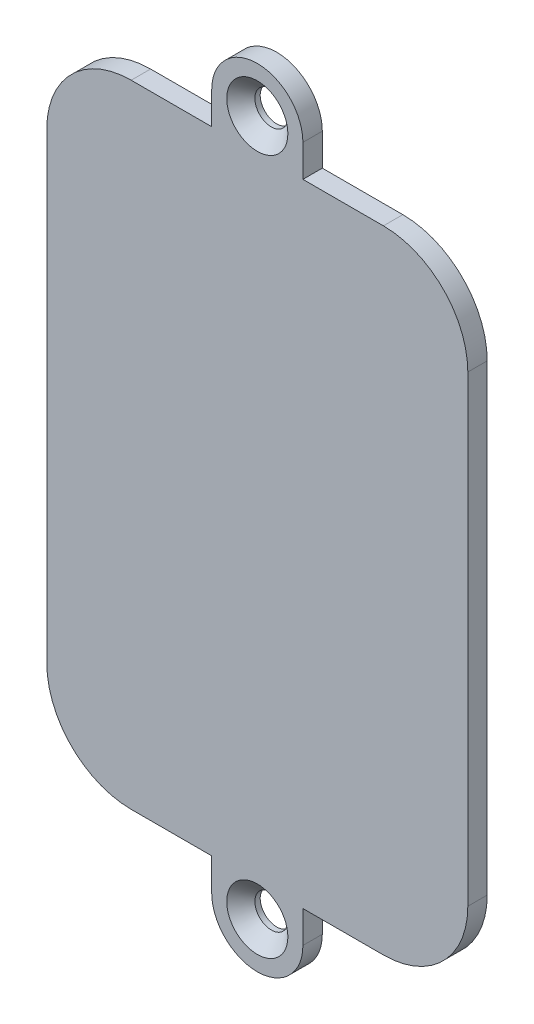
ISO-10303-21;
HEADER;
FILE_DESCRIPTION(('STEP AP214'),'2;1');
FILE_NAME('part.step','',(''),(''),'','','');
FILE_SCHEMA(('AUTOMOTIVE_DESIGN { 1 0 10303 214 1 1 1 1 }'));
ENDSEC;
DATA;
#1=APPLICATION_CONTEXT('core data for automotive mechanical design processes');
#2=APPLICATION_PROTOCOL_DEFINITION('international standard','automotive_design',2000,#1);
#3=PRODUCT_CONTEXT('',#1,'mechanical');
#4=PRODUCT('Part','Part','',(#3));
#5=PRODUCT_RELATED_PRODUCT_CATEGORY('part','',(#4));
#6=PRODUCT_DEFINITION_FORMATION('','',#4);
#7=PRODUCT_DEFINITION_CONTEXT('part definition',#1,'design');
#8=PRODUCT_DEFINITION('design','',#6,#7);
#9=PRODUCT_DEFINITION_SHAPE('','',#8);
#10=(LENGTH_UNIT() NAMED_UNIT(*) SI_UNIT(.MILLI.,.METRE.));
#11=(NAMED_UNIT(*) PLANE_ANGLE_UNIT() SI_UNIT($,.RADIAN.));
#12=(NAMED_UNIT(*) SI_UNIT($,.STERADIAN.) SOLID_ANGLE_UNIT());
#13=UNCERTAINTY_MEASURE_WITH_UNIT(LENGTH_MEASURE(1.E-05),#10,'distance_accuracy_value','');
#14=(GEOMETRIC_REPRESENTATION_CONTEXT(3) GLOBAL_UNCERTAINTY_ASSIGNED_CONTEXT((#13)) GLOBAL_UNIT_ASSIGNED_CONTEXT((#10,
#11,#12)) REPRESENTATION_CONTEXT('',''));
#15=CARTESIAN_POINT('',(0.,0.,0.));
#16=DIRECTION('',(0.,0.,1.));
#17=DIRECTION('',(1.,0.,0.));
#18=AXIS2_PLACEMENT_3D('',#15,#16,#17);
#19=CARTESIAN_POINT('',(0.,69.04,2.));
#20=DIRECTION('',(0.,0.,-1.));
#21=DIRECTION('',(-1.,0.,0.));
#22=AXIS2_PLACEMENT_3D('',#19,#20,#21);
#23=CYLINDRICAL_SURFACE('',#22,4.7);
#24=CARTESIAN_POINT('',(0.,69.04,0.));
#25=DIRECTION('',(0.,0.,1.));
#26=DIRECTION('',(1.,0.,0.));
#27=AXIS2_PLACEMENT_3D('',#24,#25,#26);
#28=CIRCLE('',#27,4.7);
#29=CARTESIAN_POINT('',(4.7,69.04,0.));
#30=VERTEX_POINT('',#29);
#31=CARTESIAN_POINT('',(-4.7,69.04,0.));
#32=VERTEX_POINT('',#31);
#33=EDGE_CURVE('E177',#30,#32,#28,.T.);
#34=ORIENTED_EDGE('',*,*,#33,.T.);
#35=DIRECTION('',(0.,0.,-1.));
#36=VECTOR('',#35,1.);
#37=CARTESIAN_POINT('',(-4.7,69.04,2.));
#38=LINE('',#37,#36);
#39=CARTESIAN_POINT('',(-4.7,69.04,2.));
#40=VERTEX_POINT('',#39);
#41=EDGE_CURVE('E11',#40,#32,#38,.T.);
#42=ORIENTED_EDGE('',*,*,#41,.F.);
#43=CARTESIAN_POINT('',(0.,69.04,2.));
#44=DIRECTION('',(0.,0.,1.));
#45=DIRECTION('',(1.,0.,0.));
#46=AXIS2_PLACEMENT_3D('',#43,#44,#45);
#47=CIRCLE('',#46,4.7);
#48=CARTESIAN_POINT('',(4.7,69.04,2.));
#49=VERTEX_POINT('',#48);
#50=EDGE_CURVE('E208',#49,#40,#47,.T.);
#51=ORIENTED_EDGE('',*,*,#50,.F.);
#52=DIRECTION('',(0.,0.,-1.));
#53=VECTOR('',#52,1.);
#54=CARTESIAN_POINT('',(4.7,69.04,2.));
#55=LINE('',#54,#53);
#56=EDGE_CURVE('E173',#49,#30,#55,.T.);
#57=ORIENTED_EDGE('',*,*,#56,.T.);
#58=EDGE_LOOP('',(#34,#42,#51,#57));
#59=FACE_BOUND('',#58,.T.);
#60=ADVANCED_FACE('F33',(#59),#23,.T.);
#61=CARTESIAN_POINT('',(-4.7,69.04,2.));
#62=DIRECTION('',(1.,0.,0.));
#63=DIRECTION('',(0.,1.,0.));
#64=AXIS2_PLACEMENT_3D('',#61,#62,#63);
#65=PLANE('',#64);
#66=DIRECTION('',(0.,-1.,0.));
#67=VECTOR('',#66,1.);
#68=CARTESIAN_POINT('',(-4.7,69.04,0.));
#69=LINE('',#68,#67);
#70=CARTESIAN_POINT('',(-4.7,65.74,0.));
#71=VERTEX_POINT('',#70);
#72=EDGE_CURVE('E180',#32,#71,#69,.T.);
#73=ORIENTED_EDGE('',*,*,#72,.T.);
#74=DIRECTION('',(0.,0.,-1.));
#75=VECTOR('',#74,1.);
#76=CARTESIAN_POINT('',(-4.7,65.74,2.));
#77=LINE('',#76,#75);
#78=CARTESIAN_POINT('',(-4.7,65.74,2.));
#79=VERTEX_POINT('',#78);
#80=EDGE_CURVE('E41',#79,#71,#77,.T.);
#81=ORIENTED_EDGE('',*,*,#80,.F.);
#82=DIRECTION('',(0.,-1.,0.));
#83=VECTOR('',#82,1.);
#84=CARTESIAN_POINT('',(-4.7,69.04,2.));
#85=LINE('',#84,#83);
#86=EDGE_CURVE('E116',#40,#79,#85,.T.);
#87=ORIENTED_EDGE('',*,*,#86,.F.);
#88=ORIENTED_EDGE('',*,*,#41,.T.);
#89=EDGE_LOOP('',(#73,#81,#87,#88));
#90=FACE_BOUND('',#89,.T.);
#91=ADVANCED_FACE('F307',(#90),#65,.F.);
#92=CARTESIAN_POINT('',(-4.7,65.74,2.));
#93=DIRECTION('',(0.,-1.,0.));
#94=DIRECTION('',(0.,0.,-1.));
#95=AXIS2_PLACEMENT_3D('',#92,#93,#94);
#96=PLANE('',#95);
#97=DIRECTION('',(-1.,0.,0.));
#98=VECTOR('',#97,1.);
#99=CARTESIAN_POINT('',(-4.7,65.74,0.));
#100=LINE('',#99,#98);
#101=CARTESIAN_POINT('',(-13.,65.74,0.));
#102=VERTEX_POINT('',#101);
#103=EDGE_CURVE('E183',#71,#102,#100,.T.);
#104=ORIENTED_EDGE('',*,*,#103,.T.);
#105=DIRECTION('',(0.,0.,-1.));
#106=VECTOR('',#105,1.);
#107=CARTESIAN_POINT('',(-13.,65.74,2.));
#108=LINE('',#107,#106);
#109=CARTESIAN_POINT('',(-13.,65.74,2.));
#110=VERTEX_POINT('',#109);
#111=EDGE_CURVE('E239',#110,#102,#108,.T.);
#112=ORIENTED_EDGE('',*,*,#111,.F.);
#113=DIRECTION('',(-1.,0.,0.));
#114=VECTOR('',#113,1.);
#115=CARTESIAN_POINT('',(-4.7,65.74,2.));
#116=LINE('',#115,#114);
#117=EDGE_CURVE('E247',#79,#110,#116,.T.);
#118=ORIENTED_EDGE('',*,*,#117,.F.);
#119=ORIENTED_EDGE('',*,*,#80,.T.);
#120=EDGE_LOOP('',(#104,#112,#118,#119));
#121=FACE_BOUND('',#120,.T.);
#122=ADVANCED_FACE('F245',(#121),#96,.F.);
#123=CARTESIAN_POINT('',(-13.,57.04,2.));
#124=DIRECTION('',(0.,0.,-1.));
#125=DIRECTION('',(-1.,0.,0.));
#126=AXIS2_PLACEMENT_3D('',#123,#124,#125);
#127=CYLINDRICAL_SURFACE('',#126,8.7);
#128=CARTESIAN_POINT('',(-13.,57.04,0.));
#129=DIRECTION('',(0.,0.,1.));
#130=DIRECTION('',(1.,0.,0.));
#131=AXIS2_PLACEMENT_3D('',#128,#129,#130);
#132=CIRCLE('',#131,8.7);
#133=CARTESIAN_POINT('',(-21.7,57.04,0.));
#134=VERTEX_POINT('',#133);
#135=EDGE_CURVE('E185',#102,#134,#132,.T.);
#136=ORIENTED_EDGE('',*,*,#135,.T.);
#137=DIRECTION('',(0.,0.,-1.));
#138=VECTOR('',#137,1.);
#139=CARTESIAN_POINT('',(-21.7,57.04,2.));
#140=LINE('',#139,#138);
#141=CARTESIAN_POINT('',(-21.7,57.04,2.));
#142=VERTEX_POINT('',#141);
#143=EDGE_CURVE('E236',#142,#134,#140,.T.);
#144=ORIENTED_EDGE('',*,*,#143,.F.);
#145=CARTESIAN_POINT('',(-13.,57.04,2.));
#146=DIRECTION('',(0.,0.,1.));
#147=DIRECTION('',(1.,0.,0.));
#148=AXIS2_PLACEMENT_3D('',#145,#146,#147);
#149=CIRCLE('',#148,8.7);
#150=EDGE_CURVE('E265',#110,#142,#149,.T.);
#151=ORIENTED_EDGE('',*,*,#150,.F.);
#152=ORIENTED_EDGE('',*,*,#111,.T.);
#153=EDGE_LOOP('',(#136,#144,#151,#152));
#154=FACE_BOUND('',#153,.T.);
#155=ADVANCED_FACE('F256',(#154),#127,.T.);
#156=CARTESIAN_POINT('',(-21.7,57.04,2.));
#157=DIRECTION('',(1.,0.,0.));
#158=DIRECTION('',(0.,1.,0.));
#159=AXIS2_PLACEMENT_3D('',#156,#157,#158);
#160=PLANE('',#159);
#161=DIRECTION('',(0.,-1.,0.));
#162=VECTOR('',#161,1.);
#163=CARTESIAN_POINT('',(-21.7,57.04,0.));
#164=LINE('',#163,#162);
#165=CARTESIAN_POINT('',(-21.7,9.34999999999999,0.));
#166=VERTEX_POINT('',#165);
#167=EDGE_CURVE('E187',#134,#166,#164,.T.);
#168=ORIENTED_EDGE('',*,*,#167,.T.);
#169=DIRECTION('',(0.,0.,-1.));
#170=VECTOR('',#169,1.);
#171=CARTESIAN_POINT('',(-21.7,9.34999999999999,2.));
#172=LINE('',#171,#170);
#173=CARTESIAN_POINT('',(-21.7,9.34999999999999,2.));
#174=VERTEX_POINT('',#173);
#175=EDGE_CURVE('E233',#174,#166,#172,.T.);
#176=ORIENTED_EDGE('',*,*,#175,.F.);
#177=DIRECTION('',(0.,-1.,0.));
#178=VECTOR('',#177,1.);
#179=CARTESIAN_POINT('',(-21.7,57.04,2.));
#180=LINE('',#179,#178);
#181=EDGE_CURVE('E262',#142,#174,#180,.T.);
#182=ORIENTED_EDGE('',*,*,#181,.F.);
#183=ORIENTED_EDGE('',*,*,#143,.T.);
#184=EDGE_LOOP('',(#168,#176,#182,#183));
#185=FACE_BOUND('',#184,.T.);
#186=ADVANCED_FACE('F260',(#185),#160,.F.);
#187=CARTESIAN_POINT('',(-13.,9.34999999999999,2.));
#188=DIRECTION('',(0.,0.,-1.));
#189=DIRECTION('',(-1.,0.,0.));
#190=AXIS2_PLACEMENT_3D('',#187,#188,#189);
#191=CYLINDRICAL_SURFACE('',#190,8.7);
#192=CARTESIAN_POINT('',(-13.,9.34999999999999,0.));
#193=DIRECTION('',(0.,0.,1.));
#194=DIRECTION('',(1.,0.,0.));
#195=AXIS2_PLACEMENT_3D('',#192,#193,#194);
#196=CIRCLE('',#195,8.7);
#197=CARTESIAN_POINT('',(-13.,0.649999999999993,0.));
#198=VERTEX_POINT('',#197);
#199=EDGE_CURVE('E189',#166,#198,#196,.T.);
#200=ORIENTED_EDGE('',*,*,#199,.T.);
#201=DIRECTION('',(0.,0.,-1.));
#202=VECTOR('',#201,1.);
#203=CARTESIAN_POINT('',(-13.,0.649999999999993,2.));
#204=LINE('',#203,#202);
#205=CARTESIAN_POINT('',(-13.,0.649999999999993,2.));
#206=VERTEX_POINT('',#205);
#207=EDGE_CURVE('E230',#206,#198,#204,.T.);
#208=ORIENTED_EDGE('',*,*,#207,.F.);
#209=CARTESIAN_POINT('',(-13.,9.34999999999999,2.));
#210=DIRECTION('',(0.,0.,1.));
#211=DIRECTION('',(1.,0.,0.));
#212=AXIS2_PLACEMENT_3D('',#209,#210,#211);
#213=CIRCLE('',#212,8.7);
#214=EDGE_CURVE('E264',#174,#206,#213,.T.);
#215=ORIENTED_EDGE('',*,*,#214,.F.);
#216=ORIENTED_EDGE('',*,*,#175,.T.);
#217=EDGE_LOOP('',(#200,#208,#215,#216));
#218=FACE_BOUND('',#217,.T.);
#219=ADVANCED_FACE('F320',(#218),#191,.T.);
#220=CARTESIAN_POINT('',(-13.,0.649999999999991,2.));
#221=DIRECTION('',(0.,1.,0.));
#222=DIRECTION('',(-1.,0.,0.));
#223=AXIS2_PLACEMENT_3D('',#220,#221,#222);
#224=PLANE('',#223);
#225=DIRECTION('',(1.,0.,0.));
#226=VECTOR('',#225,1.);
#227=CARTESIAN_POINT('',(-13.,0.649999999999991,0.));
#228=LINE('',#227,#226);
#229=CARTESIAN_POINT('',(-4.69999999999999,0.64999999999999,0.));
#230=VERTEX_POINT('',#229);
#231=EDGE_CURVE('E191',#198,#230,#228,.T.);
#232=ORIENTED_EDGE('',*,*,#231,.T.);
#233=DIRECTION('',(0.,0.,-1.));
#234=VECTOR('',#233,1.);
#235=CARTESIAN_POINT('',(-4.69999999999999,0.64999999999999,2.));
#236=LINE('',#235,#234);
#237=CARTESIAN_POINT('',(-4.69999999999999,0.64999999999999,2.));
#238=VERTEX_POINT('',#237);
#239=EDGE_CURVE('E227',#238,#230,#236,.T.);
#240=ORIENTED_EDGE('',*,*,#239,.F.);
#241=DIRECTION('',(1.,0.,0.));
#242=VECTOR('',#241,1.);
#243=CARTESIAN_POINT('',(-13.,0.649999999999991,2.));
#244=LINE('',#243,#242);
#245=EDGE_CURVE('E267',#206,#238,#244,.T.);
#246=ORIENTED_EDGE('',*,*,#245,.F.);
#247=ORIENTED_EDGE('',*,*,#207,.T.);
#248=EDGE_LOOP('',(#232,#240,#246,#247));
#249=FACE_BOUND('',#248,.T.);
#250=ADVANCED_FACE('F323',(#249),#224,.F.);
#251=CARTESIAN_POINT('',(-4.69999999999999,0.64999999999999,2.));
#252=DIRECTION('',(1.,0.,0.));
#253=DIRECTION('',(0.,1.,0.));
#254=AXIS2_PLACEMENT_3D('',#251,#252,#253);
#255=PLANE('',#254);
#256=DIRECTION('',(0.,-1.,0.));
#257=VECTOR('',#256,1.);
#258=CARTESIAN_POINT('',(-4.69999999999999,0.64999999999999,0.));
#259=LINE('',#258,#257);
#260=CARTESIAN_POINT('',(-4.69999999999999,-2.65000000000001,0.));
#261=VERTEX_POINT('',#260);
#262=EDGE_CURVE('E193',#230,#261,#259,.T.);
#263=ORIENTED_EDGE('',*,*,#262,.T.);
#264=DIRECTION('',(0.,0.,-1.));
#265=VECTOR('',#264,1.);
#266=CARTESIAN_POINT('',(-4.69999999999999,-2.65000000000001,2.));
#267=LINE('',#266,#265);
#268=CARTESIAN_POINT('',(-4.69999999999999,-2.65000000000001,2.));
#269=VERTEX_POINT('',#268);
#270=EDGE_CURVE('E224',#269,#261,#267,.T.);
#271=ORIENTED_EDGE('',*,*,#270,.F.);
#272=DIRECTION('',(0.,-1.,0.));
#273=VECTOR('',#272,1.);
#274=CARTESIAN_POINT('',(-4.69999999999999,0.64999999999999,2.));
#275=LINE('',#274,#273);
#276=EDGE_CURVE('E273',#238,#269,#275,.T.);
#277=ORIENTED_EDGE('',*,*,#276,.F.);
#278=ORIENTED_EDGE('',*,*,#239,.T.);
#279=EDGE_LOOP('',(#263,#271,#277,#278));
#280=FACE_BOUND('',#279,.T.);
#281=ADVANCED_FACE('F327',(#280),#255,.F.);
#282=CARTESIAN_POINT('',(0.,-2.65000000000001,2.));
#283=DIRECTION('',(0.,0.,-1.));
#284=DIRECTION('',(-1.,0.,0.));
#285=AXIS2_PLACEMENT_3D('',#282,#283,#284);
#286=CYLINDRICAL_SURFACE('',#285,4.7);
#287=CARTESIAN_POINT('',(0.,-2.65000000000001,0.));
#288=DIRECTION('',(0.,0.,1.));
#289=DIRECTION('',(1.,0.,0.));
#290=AXIS2_PLACEMENT_3D('',#287,#288,#289);
#291=CIRCLE('',#290,4.7);
#292=CARTESIAN_POINT('',(4.70000000000001,-2.65000000000001,0.));
#293=VERTEX_POINT('',#292);
#294=EDGE_CURVE('E195',#261,#293,#291,.T.);
#295=ORIENTED_EDGE('',*,*,#294,.T.);
#296=DIRECTION('',(0.,0.,-1.));
#297=VECTOR('',#296,1.);
#298=CARTESIAN_POINT('',(4.70000000000001,-2.65000000000001,2.));
#299=LINE('',#298,#297);
#300=CARTESIAN_POINT('',(4.70000000000001,-2.65000000000001,2.));
#301=VERTEX_POINT('',#300);
#302=EDGE_CURVE('E221',#301,#293,#299,.T.);
#303=ORIENTED_EDGE('',*,*,#302,.F.);
#304=CARTESIAN_POINT('',(0.,-2.65000000000001,2.));
#305=DIRECTION('',(0.,0.,1.));
#306=DIRECTION('',(1.,0.,0.));
#307=AXIS2_PLACEMENT_3D('',#304,#305,#306);
#308=CIRCLE('',#307,4.7);
#309=EDGE_CURVE('E275',#269,#301,#308,.T.);
#310=ORIENTED_EDGE('',*,*,#309,.F.);
#311=ORIENTED_EDGE('',*,*,#270,.T.);
#312=EDGE_LOOP('',(#295,#303,#310,#311));
#313=FACE_BOUND('',#312,.T.);
#314=ADVANCED_FACE('F331',(#313),#286,.T.);
#315=CARTESIAN_POINT('',(4.70000000000001,-2.65000000000001,2.));
#316=DIRECTION('',(-1.,0.,0.));
#317=DIRECTION('',(0.,-1.,0.));
#318=AXIS2_PLACEMENT_3D('',#315,#316,#317);
#319=PLANE('',#318);
#320=DIRECTION('',(0.,1.,0.));
#321=VECTOR('',#320,1.);
#322=CARTESIAN_POINT('',(4.70000000000001,-2.65000000000001,0.));
#323=LINE('',#322,#321);
#324=CARTESIAN_POINT('',(4.70000000000001,0.64999999999999,0.));
#325=VERTEX_POINT('',#324);
#326=EDGE_CURVE('E197',#293,#325,#323,.T.);
#327=ORIENTED_EDGE('',*,*,#326,.T.);
#328=DIRECTION('',(0.,0.,-1.));
#329=VECTOR('',#328,1.);
#330=CARTESIAN_POINT('',(4.70000000000001,0.64999999999999,2.));
#331=LINE('',#330,#329);
#332=CARTESIAN_POINT('',(4.70000000000001,0.64999999999999,2.));
#333=VERTEX_POINT('',#332);
#334=EDGE_CURVE('E218',#333,#325,#331,.T.);
#335=ORIENTED_EDGE('',*,*,#334,.F.);
#336=DIRECTION('',(0.,1.,0.));
#337=VECTOR('',#336,1.);
#338=CARTESIAN_POINT('',(4.70000000000001,-2.65000000000001,2.));
#339=LINE('',#338,#337);
#340=EDGE_CURVE('E277',#301,#333,#339,.T.);
#341=ORIENTED_EDGE('',*,*,#340,.F.);
#342=ORIENTED_EDGE('',*,*,#302,.T.);
#343=EDGE_LOOP('',(#327,#335,#341,#342));
#344=FACE_BOUND('',#343,.T.);
#345=ADVANCED_FACE('F335',(#344),#319,.F.);
#346=CARTESIAN_POINT('',(4.70000000000001,0.64999999999999,2.));
#347=DIRECTION('',(0.,1.,0.));
#348=DIRECTION('',(-1.,0.,0.));
#349=AXIS2_PLACEMENT_3D('',#346,#347,#348);
#350=PLANE('',#349);
#351=DIRECTION('',(1.,0.,0.));
#352=VECTOR('',#351,1.);
#353=CARTESIAN_POINT('',(4.70000000000001,0.64999999999999,0.));
#354=LINE('',#353,#352);
#355=CARTESIAN_POINT('',(13.,0.649999999999991,0.));
#356=VERTEX_POINT('',#355);
#357=EDGE_CURVE('E199',#325,#356,#354,.T.);
#358=ORIENTED_EDGE('',*,*,#357,.T.);
#359=DIRECTION('',(0.,0.,-1.));
#360=VECTOR('',#359,1.);
#361=CARTESIAN_POINT('',(13.,0.649999999999991,2.));
#362=LINE('',#361,#360);
#363=CARTESIAN_POINT('',(13.,0.649999999999991,2.));
#364=VERTEX_POINT('',#363);
#365=EDGE_CURVE('E215',#364,#356,#362,.T.);
#366=ORIENTED_EDGE('',*,*,#365,.F.);
#367=DIRECTION('',(1.,0.,0.));
#368=VECTOR('',#367,1.);
#369=CARTESIAN_POINT('',(4.70000000000001,0.64999999999999,2.));
#370=LINE('',#369,#368);
#371=EDGE_CURVE('E279',#333,#364,#370,.T.);
#372=ORIENTED_EDGE('',*,*,#371,.F.);
#373=ORIENTED_EDGE('',*,*,#334,.T.);
#374=EDGE_LOOP('',(#358,#366,#372,#373));
#375=FACE_BOUND('',#374,.T.);
#376=ADVANCED_FACE('F339',(#375),#350,.F.);
#377=CARTESIAN_POINT('',(13.,9.34999999999999,2.));
#378=DIRECTION('',(0.,0.,-1.));
#379=DIRECTION('',(-1.,0.,0.));
#380=AXIS2_PLACEMENT_3D('',#377,#378,#379);
#381=CYLINDRICAL_SURFACE('',#380,8.7);
#382=CARTESIAN_POINT('',(13.,9.34999999999999,0.));
#383=DIRECTION('',(0.,0.,1.));
#384=DIRECTION('',(1.,0.,0.));
#385=AXIS2_PLACEMENT_3D('',#382,#383,#384);
#386=CIRCLE('',#385,8.7);
#387=CARTESIAN_POINT('',(21.7,9.34999999999999,0.));
#388=VERTEX_POINT('',#387);
#389=EDGE_CURVE('E201',#356,#388,#386,.T.);
#390=ORIENTED_EDGE('',*,*,#389,.T.);
#391=DIRECTION('',(0.,0.,-1.));
#392=VECTOR('',#391,1.);
#393=CARTESIAN_POINT('',(21.7,9.34999999999999,2.));
#394=LINE('',#393,#392);
#395=CARTESIAN_POINT('',(21.7,9.34999999999999,2.));
#396=VERTEX_POINT('',#395);
#397=EDGE_CURVE('E212',#396,#388,#394,.T.);
#398=ORIENTED_EDGE('',*,*,#397,.F.);
#399=CARTESIAN_POINT('',(13.,9.34999999999999,2.));
#400=DIRECTION('',(0.,0.,1.));
#401=DIRECTION('',(1.,0.,0.));
#402=AXIS2_PLACEMENT_3D('',#399,#400,#401);
#403=CIRCLE('',#402,8.7);
#404=EDGE_CURVE('E281',#364,#396,#403,.T.);
#405=ORIENTED_EDGE('',*,*,#404,.F.);
#406=ORIENTED_EDGE('',*,*,#365,.T.);
#407=EDGE_LOOP('',(#390,#398,#405,#406));
#408=FACE_BOUND('',#407,.T.);
#409=ADVANCED_FACE('F287',(#408),#381,.T.);
#410=CARTESIAN_POINT('',(21.7,9.34999999999999,2.));
#411=DIRECTION('',(-1.,0.,0.));
#412=DIRECTION('',(0.,-1.,0.));
#413=AXIS2_PLACEMENT_3D('',#410,#411,#412);
#414=PLANE('',#413);
#415=DIRECTION('',(0.,1.,0.));
#416=VECTOR('',#415,1.);
#417=CARTESIAN_POINT('',(21.7,9.34999999999999,0.));
#418=LINE('',#417,#416);
#419=CARTESIAN_POINT('',(21.7,57.04,0.));
#420=VERTEX_POINT('',#419);
#421=EDGE_CURVE('E203',#388,#420,#418,.T.);
#422=ORIENTED_EDGE('',*,*,#421,.T.);
#423=DIRECTION('',(0.,0.,-1.));
#424=VECTOR('',#423,1.);
#425=CARTESIAN_POINT('',(21.7,57.04,2.));
#426=LINE('',#425,#424);
#427=CARTESIAN_POINT('',(21.7,57.04,2.));
#428=VERTEX_POINT('',#427);
#429=EDGE_CURVE('E168',#428,#420,#426,.T.);
#430=ORIENTED_EDGE('',*,*,#429,.F.);
#431=DIRECTION('',(0.,1.,0.));
#432=VECTOR('',#431,1.);
#433=CARTESIAN_POINT('',(21.7,9.34999999999999,2.));
#434=LINE('',#433,#432);
#435=EDGE_CURVE('E159',#396,#428,#434,.T.);
#436=ORIENTED_EDGE('',*,*,#435,.F.);
#437=ORIENTED_EDGE('',*,*,#397,.T.);
#438=EDGE_LOOP('',(#422,#430,#436,#437));
#439=FACE_BOUND('',#438,.T.);
#440=ADVANCED_FACE('F291',(#439),#414,.F.);
#441=CARTESIAN_POINT('',(13.,57.04,2.));
#442=DIRECTION('',(0.,0.,-1.));
#443=DIRECTION('',(-1.,0.,0.));
#444=AXIS2_PLACEMENT_3D('',#441,#442,#443);
#445=CYLINDRICAL_SURFACE('',#444,8.7);
#446=CARTESIAN_POINT('',(13.,57.04,0.));
#447=DIRECTION('',(0.,0.,1.));
#448=DIRECTION('',(1.,0.,0.));
#449=AXIS2_PLACEMENT_3D('',#446,#447,#448);
#450=CIRCLE('',#449,8.7);
#451=CARTESIAN_POINT('',(13.,65.74,0.));
#452=VERTEX_POINT('',#451);
#453=EDGE_CURVE('E167',#420,#452,#450,.T.);
#454=ORIENTED_EDGE('',*,*,#453,.T.);
#455=DIRECTION('',(0.,0.,-1.));
#456=VECTOR('',#455,1.);
#457=CARTESIAN_POINT('',(13.,65.74,2.));
#458=LINE('',#457,#456);
#459=CARTESIAN_POINT('',(13.,65.74,2.));
#460=VERTEX_POINT('',#459);
#461=EDGE_CURVE('E164',#460,#452,#458,.T.);
#462=ORIENTED_EDGE('',*,*,#461,.F.);
#463=CARTESIAN_POINT('',(13.,57.04,2.));
#464=DIRECTION('',(0.,0.,1.));
#465=DIRECTION('',(1.,0.,0.));
#466=AXIS2_PLACEMENT_3D('',#463,#464,#465);
#467=CIRCLE('',#466,8.7);
#468=EDGE_CURVE('E153',#428,#460,#467,.T.);
#469=ORIENTED_EDGE('',*,*,#468,.F.);
#470=ORIENTED_EDGE('',*,*,#429,.T.);
#471=EDGE_LOOP('',(#454,#462,#469,#470));
#472=FACE_BOUND('',#471,.T.);
#473=ADVANCED_FACE('F165',(#472),#445,.T.);
#474=CARTESIAN_POINT('',(13.,65.74,2.));
#475=DIRECTION('',(0.,-1.,0.));
#476=DIRECTION('',(0.,0.,-1.));
#477=AXIS2_PLACEMENT_3D('',#474,#475,#476);
#478=PLANE('',#477);
#479=DIRECTION('',(-1.,0.,0.));
#480=VECTOR('',#479,1.);
#481=CARTESIAN_POINT('',(13.,65.74,0.));
#482=LINE('',#481,#480);
#483=CARTESIAN_POINT('',(4.7,65.74,0.));
#484=VERTEX_POINT('',#483);
#485=EDGE_CURVE('E102',#452,#484,#482,.T.);
#486=ORIENTED_EDGE('',*,*,#485,.T.);
#487=DIRECTION('',(0.,0.,-1.));
#488=VECTOR('',#487,1.);
#489=CARTESIAN_POINT('',(4.7,65.74,2.));
#490=LINE('',#489,#488);
#491=CARTESIAN_POINT('',(4.7,65.74,2.));
#492=VERTEX_POINT('',#491);
#493=EDGE_CURVE('E169',#492,#484,#490,.T.);
#494=ORIENTED_EDGE('',*,*,#493,.F.);
#495=DIRECTION('',(-1.,0.,0.));
#496=VECTOR('',#495,1.);
#497=CARTESIAN_POINT('',(13.,65.74,2.));
#498=LINE('',#497,#496);
#499=EDGE_CURVE('E157',#460,#492,#498,.T.);
#500=ORIENTED_EDGE('',*,*,#499,.F.);
#501=ORIENTED_EDGE('',*,*,#461,.T.);
#502=EDGE_LOOP('',(#486,#494,#500,#501));
#503=FACE_BOUND('',#502,.T.);
#504=ADVANCED_FACE('F171',(#503),#478,.F.);
#505=CARTESIAN_POINT('',(4.7,65.74,2.));
#506=DIRECTION('',(-1.,0.,0.));
#507=DIRECTION('',(0.,-1.,0.));
#508=AXIS2_PLACEMENT_3D('',#505,#506,#507);
#509=PLANE('',#508);
#510=DIRECTION('',(0.,1.,0.));
#511=VECTOR('',#510,1.);
#512=CARTESIAN_POINT('',(4.7,65.74,0.));
#513=LINE('',#512,#511);
#514=EDGE_CURVE('E108',#484,#30,#513,.T.);
#515=ORIENTED_EDGE('',*,*,#514,.T.);
#516=ORIENTED_EDGE('',*,*,#56,.F.);
#517=DIRECTION('',(0.,1.,0.));
#518=VECTOR('',#517,1.);
#519=CARTESIAN_POINT('',(4.7,65.74,2.));
#520=LINE('',#519,#518);
#521=EDGE_CURVE('E49',#492,#49,#520,.T.);
#522=ORIENTED_EDGE('',*,*,#521,.F.);
#523=ORIENTED_EDGE('',*,*,#493,.T.);
#524=EDGE_LOOP('',(#515,#516,#522,#523));
#525=FACE_BOUND('',#524,.T.);
#526=ADVANCED_FACE('F295',(#525),#509,.F.);
#527=CARTESIAN_POINT('',(0.,69.04,2.));
#528=DIRECTION('',(0.,0.,1.));
#529=DIRECTION('',(1.,0.,0.));
#530=AXIS2_PLACEMENT_3D('',#527,#528,#529);
#531=PLANE('',#530);
#532=CARTESIAN_POINT('',(0.,69.04,2.));
#533=DIRECTION('',(0.,0.,1.));
#534=DIRECTION('',(1.,0.,0.));
#535=AXIS2_PLACEMENT_3D('',#532,#533,#534);
#536=CIRCLE('',#535,3.15);
#537=CARTESIAN_POINT('',(3.15,69.04,2.));
#538=VERTEX_POINT('',#537);
#539=EDGE_CURVE('E425',#538,#538,#536,.T.);
#540=ORIENTED_EDGE('',*,*,#539,.F.);
#541=EDGE_LOOP('',(#540));
#542=FACE_BOUND('',#541,.T.);
#543=CARTESIAN_POINT('',(0.,-2.65000000000001,2.));
#544=DIRECTION('',(0.,0.,1.));
#545=DIRECTION('',(1.,0.,0.));
#546=AXIS2_PLACEMENT_3D('',#543,#544,#545);
#547=CIRCLE('',#546,3.15);
#548=CARTESIAN_POINT('',(3.15000000000001,-2.65000000000001,2.));
#549=VERTEX_POINT('',#548);
#550=EDGE_CURVE('E432',#549,#549,#547,.T.);
#551=ORIENTED_EDGE('',*,*,#550,.F.);
#552=EDGE_LOOP('',(#551));
#553=FACE_BOUND('',#552,.T.);
#554=ORIENTED_EDGE('',*,*,#50,.T.);
#555=ORIENTED_EDGE('',*,*,#86,.T.);
#556=ORIENTED_EDGE('',*,*,#117,.T.);
#557=ORIENTED_EDGE('',*,*,#150,.T.);
#558=ORIENTED_EDGE('',*,*,#181,.T.);
#559=ORIENTED_EDGE('',*,*,#214,.T.);
#560=ORIENTED_EDGE('',*,*,#245,.T.);
#561=ORIENTED_EDGE('',*,*,#276,.T.);
#562=ORIENTED_EDGE('',*,*,#309,.T.);
#563=ORIENTED_EDGE('',*,*,#340,.T.);
#564=ORIENTED_EDGE('',*,*,#371,.T.);
#565=ORIENTED_EDGE('',*,*,#404,.T.);
#566=ORIENTED_EDGE('',*,*,#435,.T.);
#567=ORIENTED_EDGE('',*,*,#468,.T.);
#568=ORIENTED_EDGE('',*,*,#499,.T.);
#569=ORIENTED_EDGE('',*,*,#521,.T.);
#570=EDGE_LOOP('',(#554,#555,#556,#557,#558,#559,#560,#561,#562,#563,#564,#565,#566,#567,#568,#569));
#571=FACE_BOUND('',#570,.T.);
#572=ADVANCED_FACE('F155',(#542,#553,#571),#531,.T.);
#573=CARTESIAN_POINT('',(0.,69.04,0.));
#574=DIRECTION('',(0.,0.,1.));
#575=DIRECTION('',(1.,0.,0.));
#576=AXIS2_PLACEMENT_3D('',#573,#574,#575);
#577=PLANE('',#576);
#578=CARTESIAN_POINT('',(0.,69.04,0.));
#579=DIRECTION('',(0.,0.,1.));
#580=DIRECTION('',(1.,0.,0.));
#581=AXIS2_PLACEMENT_3D('',#578,#579,#580);
#582=CIRCLE('',#581,1.7);
#583=CARTESIAN_POINT('',(1.7,69.04,0.));
#584=VERTEX_POINT('',#583);
#585=EDGE_CURVE('E427',#584,#584,#582,.T.);
#586=ORIENTED_EDGE('',*,*,#585,.T.);
#587=EDGE_LOOP('',(#586));
#588=FACE_BOUND('',#587,.T.);
#589=CARTESIAN_POINT('',(0.,-2.65000000000001,0.));
#590=DIRECTION('',(0.,0.,1.));
#591=DIRECTION('',(1.,0.,0.));
#592=AXIS2_PLACEMENT_3D('',#589,#590,#591);
#593=CIRCLE('',#592,1.7);
#594=CARTESIAN_POINT('',(1.70000000000001,-2.65000000000001,0.));
#595=VERTEX_POINT('',#594);
#596=EDGE_CURVE('E181',#595,#595,#593,.T.);
#597=ORIENTED_EDGE('',*,*,#596,.T.);
#598=EDGE_LOOP('',(#597));
#599=FACE_BOUND('',#598,.T.);
#600=ORIENTED_EDGE('',*,*,#33,.F.);
#601=ORIENTED_EDGE('',*,*,#514,.F.);
#602=ORIENTED_EDGE('',*,*,#485,.F.);
#603=ORIENTED_EDGE('',*,*,#453,.F.);
#604=ORIENTED_EDGE('',*,*,#421,.F.);
#605=ORIENTED_EDGE('',*,*,#389,.F.);
#606=ORIENTED_EDGE('',*,*,#357,.F.);
#607=ORIENTED_EDGE('',*,*,#326,.F.);
#608=ORIENTED_EDGE('',*,*,#294,.F.);
#609=ORIENTED_EDGE('',*,*,#262,.F.);
#610=ORIENTED_EDGE('',*,*,#231,.F.);
#611=ORIENTED_EDGE('',*,*,#199,.F.);
#612=ORIENTED_EDGE('',*,*,#167,.F.);
#613=ORIENTED_EDGE('',*,*,#135,.F.);
#614=ORIENTED_EDGE('',*,*,#103,.F.);
#615=ORIENTED_EDGE('',*,*,#72,.F.);
#616=EDGE_LOOP('',(#600,#601,#602,#603,#604,#605,#606,#607,#608,#609,#610,#611,#612,#613,#614,#615));
#617=FACE_BOUND('',#616,.T.);
#618=ADVANCED_FACE('F251',(#588,#599,#617),#577,.F.);
#619=CARTESIAN_POINT('',(0.,-2.65000000000001,2.));
#620=DIRECTION('',(0.,0.,1.));
#621=DIRECTION('',(1.,0.,0.));
#622=AXIS2_PLACEMENT_3D('',#619,#620,#621);
#623=CYLINDRICAL_SURFACE('',#622,1.7);
#624=ORIENTED_EDGE('',*,*,#596,.F.);
#625=EDGE_LOOP('',(#624));
#626=FACE_BOUND('',#625,.T.);
#627=CARTESIAN_POINT('',(0.,-2.65000000000001,0.549999999999998));
#628=DIRECTION('',(0.,0.,1.));
#629=DIRECTION('',(1.,0.,0.));
#630=AXIS2_PLACEMENT_3D('',#627,#628,#629);
#631=CIRCLE('',#630,1.7);
#632=CARTESIAN_POINT('',(1.70000000000001,-2.65000000000001,0.549999999999998));
#633=VERTEX_POINT('',#632);
#634=EDGE_CURVE('E435',#633,#633,#631,.T.);
#635=ORIENTED_EDGE('',*,*,#634,.T.);
#636=EDGE_LOOP('',(#635));
#637=FACE_BOUND('',#636,.T.);
#638=ADVANCED_FACE('F376',(#626,#637),#623,.F.);
#639=CARTESIAN_POINT('',(0.,-2.65000000000001,2.));
#640=DIRECTION('',(0.,0.,1.));
#641=DIRECTION('',(1.,0.,0.));
#642=AXIS2_PLACEMENT_3D('',#639,#640,#641);
#643=CONICAL_SURFACE('',#642,3.15,0.785398163397447);
#644=ORIENTED_EDGE('',*,*,#634,.F.);
#645=EDGE_LOOP('',(#644));
#646=FACE_BOUND('',#645,.T.);
#647=ORIENTED_EDGE('',*,*,#550,.T.);
#648=EDGE_LOOP('',(#647));
#649=FACE_BOUND('',#648,.T.);
#650=ADVANCED_FACE('F385',(#646,#649),#643,.F.);
#651=CARTESIAN_POINT('',(0.,69.04,2.));
#652=DIRECTION('',(0.,0.,1.));
#653=DIRECTION('',(1.,0.,0.));
#654=AXIS2_PLACEMENT_3D('',#651,#652,#653);
#655=CYLINDRICAL_SURFACE('',#654,1.7);
#656=ORIENTED_EDGE('',*,*,#585,.F.);
#657=EDGE_LOOP('',(#656));
#658=FACE_BOUND('',#657,.T.);
#659=CARTESIAN_POINT('',(0.,69.04,0.549999999999998));
#660=DIRECTION('',(0.,0.,1.));
#661=DIRECTION('',(1.,0.,0.));
#662=AXIS2_PLACEMENT_3D('',#659,#660,#661);
#663=CIRCLE('',#662,1.7);
#664=CARTESIAN_POINT('',(1.7,69.04,0.549999999999998));
#665=VERTEX_POINT('',#664);
#666=EDGE_CURVE('E422',#665,#665,#663,.T.);
#667=ORIENTED_EDGE('',*,*,#666,.T.);
#668=EDGE_LOOP('',(#667));
#669=FACE_BOUND('',#668,.T.);
#670=ADVANCED_FACE('F395',(#658,#669),#655,.F.);
#671=CARTESIAN_POINT('',(0.,69.04,2.));
#672=DIRECTION('',(0.,0.,1.));
#673=DIRECTION('',(1.,0.,0.));
#674=AXIS2_PLACEMENT_3D('',#671,#672,#673);
#675=CONICAL_SURFACE('',#674,3.15,0.785398163397447);
#676=ORIENTED_EDGE('',*,*,#666,.F.);
#677=EDGE_LOOP('',(#676));
#678=FACE_BOUND('',#677,.T.);
#679=ORIENTED_EDGE('',*,*,#539,.T.);
#680=EDGE_LOOP('',(#679));
#681=FACE_BOUND('',#680,.T.);
#682=ADVANCED_FACE('F405',(#678,#681),#675,.F.);
#683=CLOSED_SHELL('',(#60,#91,#122,#155,#186,#219,#250,#281,#314,#345,#376,#409,#440,#473,#504,
#526,#572,#618,#638,#650,#670,#682));
#684=MANIFOLD_SOLID_BREP('B2',#683);
#685=ADVANCED_BREP_SHAPE_REPRESENTATION('',(#18,#684),#14);
#686=SHAPE_DEFINITION_REPRESENTATION(#9,#685);
ENDSEC;
END-ISO-10303-21;
